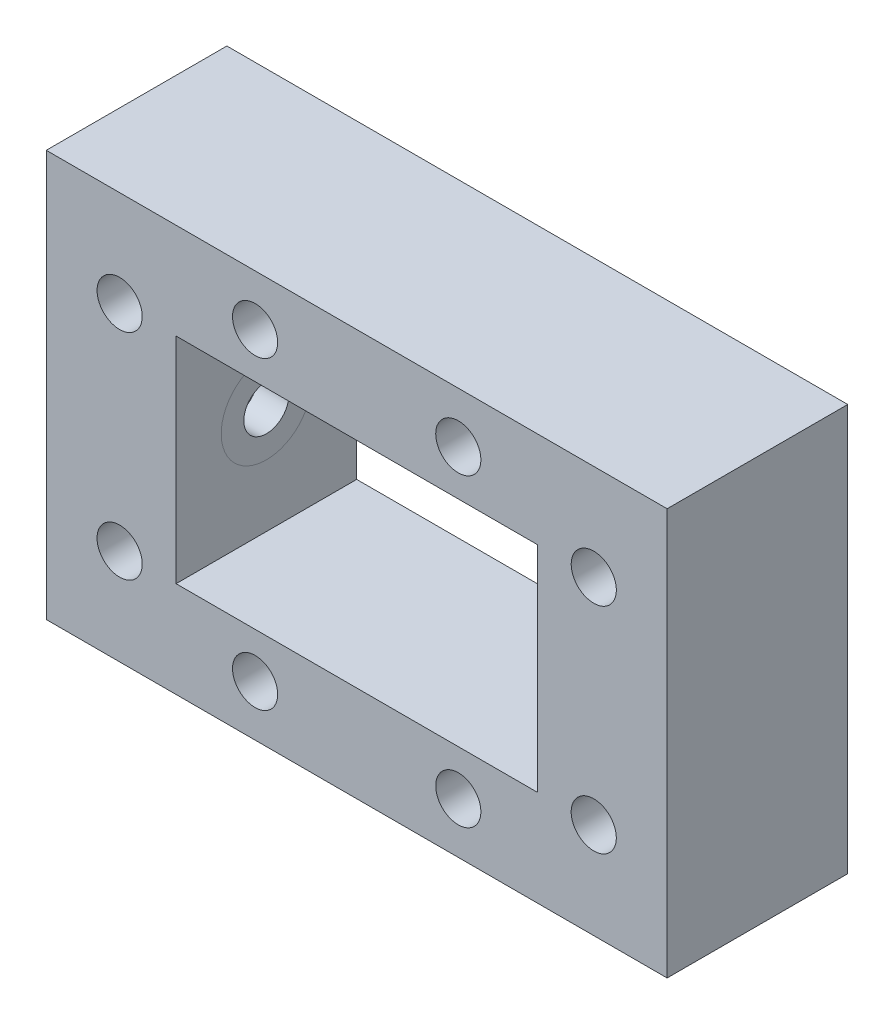
ISO-10303-21;
HEADER;
FILE_DESCRIPTION(('STEP AP214'),'2;1');
FILE_NAME('part.step','',(''),(''),'','','');
FILE_SCHEMA(('AUTOMOTIVE_DESIGN { 1 0 10303 214 1 1 1 1 }'));
ENDSEC;
DATA;
#1=APPLICATION_CONTEXT('core data for automotive mechanical design processes');
#2=APPLICATION_PROTOCOL_DEFINITION('international standard','automotive_design',2000,#1);
#3=PRODUCT_CONTEXT('',#1,'mechanical');
#4=PRODUCT('Part','Part','',(#3));
#5=PRODUCT_RELATED_PRODUCT_CATEGORY('part','',(#4));
#6=PRODUCT_DEFINITION_FORMATION('','',#4);
#7=PRODUCT_DEFINITION_CONTEXT('part definition',#1,'design');
#8=PRODUCT_DEFINITION('design','',#6,#7);
#9=PRODUCT_DEFINITION_SHAPE('','',#8);
#10=(LENGTH_UNIT() NAMED_UNIT(*) SI_UNIT(.MILLI.,.METRE.));
#11=(NAMED_UNIT(*) PLANE_ANGLE_UNIT() SI_UNIT($,.RADIAN.));
#12=(NAMED_UNIT(*) SI_UNIT($,.STERADIAN.) SOLID_ANGLE_UNIT());
#13=UNCERTAINTY_MEASURE_WITH_UNIT(LENGTH_MEASURE(1.E-05),#10,'distance_accuracy_value','');
#14=(GEOMETRIC_REPRESENTATION_CONTEXT(3) GLOBAL_UNCERTAINTY_ASSIGNED_CONTEXT((#13)) GLOBAL_UNIT_ASSIGNED_CONTEXT((#10,
#11,#12)) REPRESENTATION_CONTEXT('',''));
#15=CARTESIAN_POINT('',(0.,0.,0.));
#16=DIRECTION('',(0.,0.,1.));
#17=DIRECTION('',(1.,0.,0.));
#18=AXIS2_PLACEMENT_3D('',#15,#16,#17);
#19=CARTESIAN_POINT('',(-20.5,0.,0.));
#20=DIRECTION('',(1.,0.,0.));
#21=DIRECTION('',(0.,1.,0.));
#22=AXIS2_PLACEMENT_3D('',#19,#20,#21);
#23=CYLINDRICAL_SURFACE('',#22,4.);
#24=CARTESIAN_POINT('',(-19.9226497308104,0.,0.));
#25=DIRECTION('',(-1.,0.,0.));
#26=DIRECTION('',(0.,0.,1.));
#27=AXIS2_PLACEMENT_3D('',#24,#25,#26);
#28=CIRCLE('',#27,4.);
#29=CARTESIAN_POINT('',(-19.9226497308104,0.,4.));
#30=VERTEX_POINT('',#29);
#31=EDGE_CURVE('E55',#30,#30,#28,.T.);
#32=ORIENTED_EDGE('',*,*,#31,.F.);
#33=EDGE_LOOP('',(#32));
#34=FACE_BOUND('',#33,.T.);
#35=CARTESIAN_POINT('',(-16.,0.,0.));
#36=DIRECTION('',(1.,0.,0.));
#37=DIRECTION('',(0.,1.,0.));
#38=AXIS2_PLACEMENT_3D('',#35,#36,#37);
#39=CIRCLE('',#38,4.);
#40=CARTESIAN_POINT('',(-16.,4.,0.));
#41=VERTEX_POINT('',#40);
#42=EDGE_CURVE('E11',#41,#41,#39,.T.);
#43=ORIENTED_EDGE('',*,*,#42,.F.);
#44=EDGE_LOOP('',(#43));
#45=FACE_BOUND('',#44,.T.);
#46=ADVANCED_FACE('F44',(#34,#45),#23,.T.);
#47=CARTESIAN_POINT('',(-16.,0.,0.));
#48=DIRECTION('',(1.,0.,0.));
#49=DIRECTION('',(0.,1.,0.));
#50=AXIS2_PLACEMENT_3D('',#47,#48,#49);
#51=PLANE('',#50);
#52=CARTESIAN_POINT('',(-16.,0.,0.));
#53=DIRECTION('',(1.,0.,0.));
#54=DIRECTION('',(0.,1.,0.));
#55=AXIS2_PLACEMENT_3D('',#52,#53,#54);
#56=CIRCLE('',#55,2.);
#57=CARTESIAN_POINT('',(-16.,2.,0.));
#58=VERTEX_POINT('',#57);
#59=EDGE_CURVE('E51',#58,#58,#56,.T.);
#60=ORIENTED_EDGE('',*,*,#59,.F.);
#61=EDGE_LOOP('',(#60));
#62=FACE_BOUND('',#61,.T.);
#63=ORIENTED_EDGE('',*,*,#42,.T.);
#64=EDGE_LOOP('',(#63));
#65=FACE_BOUND('',#64,.T.);
#66=ADVANCED_FACE('F73',(#62,#65),#51,.T.);
#67=CARTESIAN_POINT('',(-20.5,0.,0.));
#68=DIRECTION('',(1.,0.,0.));
#69=DIRECTION('',(0.,1.,0.));
#70=AXIS2_PLACEMENT_3D('',#67,#68,#69);
#71=CYLINDRICAL_SURFACE('',#70,2.);
#72=CARTESIAN_POINT('',(-18.7679491924311,0.,0.));
#73=DIRECTION('',(-1.,0.,0.));
#74=DIRECTION('',(0.,0.,1.));
#75=AXIS2_PLACEMENT_3D('',#72,#73,#74);
#76=CIRCLE('',#75,2.);
#77=CARTESIAN_POINT('',(-18.7679491924311,0.,2.));
#78=VERTEX_POINT('',#77);
#79=EDGE_CURVE('E47',#78,#78,#76,.T.);
#80=ORIENTED_EDGE('',*,*,#79,.T.);
#81=EDGE_LOOP('',(#80));
#82=FACE_BOUND('',#81,.T.);
#83=ORIENTED_EDGE('',*,*,#59,.T.);
#84=EDGE_LOOP('',(#83));
#85=FACE_BOUND('',#84,.T.);
#86=ADVANCED_FACE('F64',(#82,#85),#71,.F.);
#87=CARTESIAN_POINT('',(-17.6132486540518,0.,0.));
#88=DIRECTION('',(-1.,0.,0.));
#89=DIRECTION('',(0.,0.,1.));
#90=AXIS2_PLACEMENT_3D('',#87,#88,#89);
#91=CONICAL_SURFACE('',#90,0.,1.04719755119659);
#92=ORIENTED_EDGE('',*,*,#31,.T.);
#93=EDGE_LOOP('',(#92));
#94=FACE_BOUND('',#93,.T.);
#95=ORIENTED_EDGE('',*,*,#79,.F.);
#96=EDGE_LOOP('',(#95));
#97=FACE_BOUND('',#96,.T.);
#98=ADVANCED_FACE('F67',(#94,#97),#91,.F.);
#99=CLOSED_SHELL('',(#46,#66,#86,#98));
#100=MANIFOLD_SOLID_BREP('B2',#99);
#101=CARTESIAN_POINT('',(0.,0.,8.));
#102=DIRECTION('',(0.,0.,1.));
#103=DIRECTION('',(1.,0.,0.));
#104=AXIS2_PLACEMENT_3D('',#101,#102,#103);
#105=PLANE('',#104);
#106=CARTESIAN_POINT('',(8.99999999999999,13.5,8.));
#107=DIRECTION('',(0.,0.,1.));
#108=DIRECTION('',(-1.,0.,0.));
#109=AXIS2_PLACEMENT_3D('',#106,#107,#108);
#110=CIRCLE('',#109,2.);
#111=CARTESIAN_POINT('',(6.99999999999999,13.5,8.));
#112=VERTEX_POINT('',#111);
#113=EDGE_CURVE('E304',#112,#112,#110,.T.);
#114=ORIENTED_EDGE('',*,*,#113,.F.);
#115=EDGE_LOOP('',(#114));
#116=FACE_BOUND('',#115,.T.);
#117=CARTESIAN_POINT('',(8.99999999999999,-13.5,8.));
#118=DIRECTION('',(0.,0.,1.));
#119=DIRECTION('',(1.,0.,0.));
#120=AXIS2_PLACEMENT_3D('',#117,#118,#119);
#121=CIRCLE('',#120,2.);
#122=CARTESIAN_POINT('',(11.,-13.5,8.));
#123=VERTEX_POINT('',#122);
#124=EDGE_CURVE('E316',#123,#123,#121,.T.);
#125=ORIENTED_EDGE('',*,*,#124,.F.);
#126=EDGE_LOOP('',(#125));
#127=FACE_BOUND('',#126,.T.);
#128=CARTESIAN_POINT('',(-21.,-9.50000000000001,8.));
#129=DIRECTION('',(0.,0.,1.));
#130=DIRECTION('',(-1.,0.,0.));
#131=AXIS2_PLACEMENT_3D('',#128,#129,#130);
#132=CIRCLE('',#131,2.);
#133=CARTESIAN_POINT('',(-23.,-9.50000000000001,8.));
#134=VERTEX_POINT('',#133);
#135=EDGE_CURVE('E328',#134,#134,#132,.T.);
#136=ORIENTED_EDGE('',*,*,#135,.F.);
#137=EDGE_LOOP('',(#136));
#138=FACE_BOUND('',#137,.T.);
#139=CARTESIAN_POINT('',(-21.,9.50000000000001,8.));
#140=DIRECTION('',(0.,0.,1.));
#141=DIRECTION('',(1.,0.,0.));
#142=AXIS2_PLACEMENT_3D('',#139,#140,#141);
#143=CIRCLE('',#142,2.);
#144=CARTESIAN_POINT('',(-19.,9.50000000000001,8.));
#145=VERTEX_POINT('',#144);
#146=EDGE_CURVE('E200',#145,#145,#143,.T.);
#147=ORIENTED_EDGE('',*,*,#146,.F.);
#148=EDGE_LOOP('',(#147));
#149=FACE_BOUND('',#148,.T.);
#150=DIRECTION('',(0.,1.,0.));
#151=VECTOR('',#150,1.);
#152=CARTESIAN_POINT('',(27.5,18.,8.));
#153=LINE('',#152,#151);
#154=CARTESIAN_POINT('',(27.5,-18.,8.));
#155=VERTEX_POINT('',#154);
#156=CARTESIAN_POINT('',(27.5,18.,8.));
#157=VERTEX_POINT('',#156);
#158=EDGE_CURVE('E210',#155,#157,#153,.T.);
#159=ORIENTED_EDGE('',*,*,#158,.T.);
#160=DIRECTION('',(-1.,0.,0.));
#161=VECTOR('',#160,1.);
#162=CARTESIAN_POINT('',(-27.5,18.,8.));
#163=LINE('',#162,#161);
#164=CARTESIAN_POINT('',(-27.5,18.,8.));
#165=VERTEX_POINT('',#164);
#166=EDGE_CURVE('E213',#157,#165,#163,.T.);
#167=ORIENTED_EDGE('',*,*,#166,.T.);
#168=DIRECTION('',(0.,-1.,0.));
#169=VECTOR('',#168,1.);
#170=CARTESIAN_POINT('',(-27.5,18.,8.));
#171=LINE('',#170,#169);
#172=CARTESIAN_POINT('',(-27.5,-18.,8.));
#173=VERTEX_POINT('',#172);
#174=EDGE_CURVE('E216',#165,#173,#171,.T.);
#175=ORIENTED_EDGE('',*,*,#174,.T.);
#176=DIRECTION('',(1.,0.,0.));
#177=VECTOR('',#176,1.);
#178=CARTESIAN_POINT('',(-27.5,-18.,8.));
#179=LINE('',#178,#177);
#180=EDGE_CURVE('E218',#173,#155,#179,.T.);
#181=ORIENTED_EDGE('',*,*,#180,.T.);
#182=EDGE_LOOP('',(#159,#167,#175,#181));
#183=FACE_BOUND('',#182,.T.);
#184=DIRECTION('',(-1.,0.,0.));
#185=VECTOR('',#184,1.);
#186=CARTESIAN_POINT('',(-16.,9.5,8.));
#187=LINE('',#186,#185);
#188=CARTESIAN_POINT('',(16.,9.5,8.));
#189=VERTEX_POINT('',#188);
#190=CARTESIAN_POINT('',(-16.,9.5,8.));
#191=VERTEX_POINT('',#190);
#192=EDGE_CURVE('E179',#189,#191,#187,.T.);
#193=ORIENTED_EDGE('',*,*,#192,.F.);
#194=DIRECTION('',(0.,1.,0.));
#195=VECTOR('',#194,1.);
#196=CARTESIAN_POINT('',(16.,9.5,8.));
#197=LINE('',#196,#195);
#198=CARTESIAN_POINT('',(16.,-9.5,8.));
#199=VERTEX_POINT('',#198);
#200=EDGE_CURVE('E171',#199,#189,#197,.T.);
#201=ORIENTED_EDGE('',*,*,#200,.F.);
#202=DIRECTION('',(1.,0.,0.));
#203=VECTOR('',#202,1.);
#204=CARTESIAN_POINT('',(-16.,-9.5,8.));
#205=LINE('',#204,#203);
#206=CARTESIAN_POINT('',(-16.,-9.5,8.));
#207=VERTEX_POINT('',#206);
#208=EDGE_CURVE('E194',#207,#199,#205,.T.);
#209=ORIENTED_EDGE('',*,*,#208,.F.);
#210=DIRECTION('',(0.,-1.,0.));
#211=VECTOR('',#210,1.);
#212=CARTESIAN_POINT('',(-16.,9.5,8.));
#213=LINE('',#212,#211);
#214=EDGE_CURVE('E192',#191,#207,#213,.T.);
#215=ORIENTED_EDGE('',*,*,#214,.F.);
#216=EDGE_LOOP('',(#193,#201,#209,#215));
#217=FACE_BOUND('',#216,.T.);
#218=CARTESIAN_POINT('',(-9.,13.5,8.));
#219=DIRECTION('',(0.,0.,1.));
#220=DIRECTION('',(1.,0.,0.));
#221=AXIS2_PLACEMENT_3D('',#218,#219,#220);
#222=CIRCLE('',#221,2.);
#223=CARTESIAN_POINT('',(-7.,13.5,8.));
#224=VERTEX_POINT('',#223);
#225=EDGE_CURVE('E334',#224,#224,#222,.T.);
#226=ORIENTED_EDGE('',*,*,#225,.F.);
#227=EDGE_LOOP('',(#226));
#228=FACE_BOUND('',#227,.T.);
#229=CARTESIAN_POINT('',(-9.,-13.5,8.));
#230=DIRECTION('',(0.,0.,1.));
#231=DIRECTION('',(-1.,0.,0.));
#232=AXIS2_PLACEMENT_3D('',#229,#230,#231);
#233=CIRCLE('',#232,2.);
#234=CARTESIAN_POINT('',(-11.,-13.5,8.));
#235=VERTEX_POINT('',#234);
#236=EDGE_CURVE('E322',#235,#235,#233,.T.);
#237=ORIENTED_EDGE('',*,*,#236,.F.);
#238=EDGE_LOOP('',(#237));
#239=FACE_BOUND('',#238,.T.);
#240=CARTESIAN_POINT('',(21.,-9.50000000000001,8.));
#241=DIRECTION('',(0.,0.,1.));
#242=DIRECTION('',(1.,0.,0.));
#243=AXIS2_PLACEMENT_3D('',#240,#241,#242);
#244=CIRCLE('',#243,2.);
#245=CARTESIAN_POINT('',(23.,-9.50000000000001,8.));
#246=VERTEX_POINT('',#245);
#247=EDGE_CURVE('E310',#246,#246,#244,.T.);
#248=ORIENTED_EDGE('',*,*,#247,.F.);
#249=EDGE_LOOP('',(#248));
#250=FACE_BOUND('',#249,.T.);
#251=CARTESIAN_POINT('',(21.,9.50000000000001,8.));
#252=DIRECTION('',(0.,0.,1.));
#253=DIRECTION('',(-1.,0.,0.));
#254=AXIS2_PLACEMENT_3D('',#251,#252,#253);
#255=CIRCLE('',#254,2.);
#256=CARTESIAN_POINT('',(19.,9.50000000000001,8.));
#257=VERTEX_POINT('',#256);
#258=EDGE_CURVE('E296',#257,#257,#255,.T.);
#259=ORIENTED_EDGE('',*,*,#258,.F.);
#260=EDGE_LOOP('',(#259));
#261=FACE_BOUND('',#260,.T.);
#262=ADVANCED_FACE('F105',(#116,#127,#138,#149,#183,#217,#228,#239,#250,#261),#105,.T.);
#263=CARTESIAN_POINT('',(0.,0.,-8.));
#264=DIRECTION('',(0.,0.,1.));
#265=DIRECTION('',(1.,0.,0.));
#266=AXIS2_PLACEMENT_3D('',#263,#264,#265);
#267=PLANE('',#266);
#268=DIRECTION('',(0.,1.,0.));
#269=VECTOR('',#268,1.);
#270=CARTESIAN_POINT('',(27.5,18.,-8.));
#271=LINE('',#270,#269);
#272=CARTESIAN_POINT('',(27.5,-18.,-8.));
#273=VERTEX_POINT('',#272);
#274=CARTESIAN_POINT('',(27.5,18.,-8.));
#275=VERTEX_POINT('',#274);
#276=EDGE_CURVE('E187',#273,#275,#271,.T.);
#277=ORIENTED_EDGE('',*,*,#276,.F.);
#278=DIRECTION('',(1.,0.,0.));
#279=VECTOR('',#278,1.);
#280=CARTESIAN_POINT('',(-27.5,-18.,-8.));
#281=LINE('',#280,#279);
#282=CARTESIAN_POINT('',(-27.5,-18.,-8.));
#283=VERTEX_POINT('',#282);
#284=EDGE_CURVE('E214',#283,#273,#281,.T.);
#285=ORIENTED_EDGE('',*,*,#284,.F.);
#286=DIRECTION('',(0.,-1.,0.));
#287=VECTOR('',#286,1.);
#288=CARTESIAN_POINT('',(-27.5,18.,-8.));
#289=LINE('',#288,#287);
#290=CARTESIAN_POINT('',(-27.5,18.,-8.));
#291=VERTEX_POINT('',#290);
#292=EDGE_CURVE('E225',#291,#283,#289,.T.);
#293=ORIENTED_EDGE('',*,*,#292,.F.);
#294=DIRECTION('',(-1.,0.,0.));
#295=VECTOR('',#294,1.);
#296=CARTESIAN_POINT('',(-27.5,18.,-8.));
#297=LINE('',#296,#295);
#298=EDGE_CURVE('E223',#275,#291,#297,.T.);
#299=ORIENTED_EDGE('',*,*,#298,.F.);
#300=EDGE_LOOP('',(#277,#285,#293,#299));
#301=FACE_BOUND('',#300,.T.);
#302=DIRECTION('',(0.,1.,0.));
#303=VECTOR('',#302,1.);
#304=CARTESIAN_POINT('',(16.,9.5,-8.));
#305=LINE('',#304,#303);
#306=CARTESIAN_POINT('',(16.,-9.5,-8.));
#307=VERTEX_POINT('',#306);
#308=CARTESIAN_POINT('',(16.,9.5,-8.));
#309=VERTEX_POINT('',#308);
#310=EDGE_CURVE('E129',#307,#309,#305,.T.);
#311=ORIENTED_EDGE('',*,*,#310,.T.);
#312=DIRECTION('',(-1.,0.,0.));
#313=VECTOR('',#312,1.);
#314=CARTESIAN_POINT('',(-16.,9.5,-8.));
#315=LINE('',#314,#313);
#316=CARTESIAN_POINT('',(-16.,9.5,-8.));
#317=VERTEX_POINT('',#316);
#318=EDGE_CURVE('E186',#309,#317,#315,.T.);
#319=ORIENTED_EDGE('',*,*,#318,.T.);
#320=DIRECTION('',(0.,-1.,0.));
#321=VECTOR('',#320,1.);
#322=CARTESIAN_POINT('',(-16.,9.5,-8.));
#323=LINE('',#322,#321);
#324=CARTESIAN_POINT('',(-16.,-9.5,-8.));
#325=VERTEX_POINT('',#324);
#326=EDGE_CURVE('E202',#317,#325,#323,.T.);
#327=ORIENTED_EDGE('',*,*,#326,.T.);
#328=DIRECTION('',(1.,0.,0.));
#329=VECTOR('',#328,1.);
#330=CARTESIAN_POINT('',(-16.,-9.5,-8.));
#331=LINE('',#330,#329);
#332=EDGE_CURVE('E180',#325,#307,#331,.T.);
#333=ORIENTED_EDGE('',*,*,#332,.T.);
#334=EDGE_LOOP('',(#311,#319,#327,#333));
#335=FACE_BOUND('',#334,.T.);
#336=CARTESIAN_POINT('',(-21.,9.50000000000001,-8.));
#337=DIRECTION('',(0.,0.,1.));
#338=DIRECTION('',(1.,0.,0.));
#339=AXIS2_PLACEMENT_3D('',#336,#337,#338);
#340=CIRCLE('',#339,2.);
#341=CARTESIAN_POINT('',(-19.,9.50000000000001,-8.));
#342=VERTEX_POINT('',#341);
#343=EDGE_CURVE('E337',#342,#342,#340,.T.);
#344=ORIENTED_EDGE('',*,*,#343,.T.);
#345=EDGE_LOOP('',(#344));
#346=FACE_BOUND('',#345,.T.);
#347=CARTESIAN_POINT('',(-9.,13.5,-8.));
#348=DIRECTION('',(0.,0.,1.));
#349=DIRECTION('',(1.,0.,0.));
#350=AXIS2_PLACEMENT_3D('',#347,#348,#349);
#351=CIRCLE('',#350,2.);
#352=CARTESIAN_POINT('',(-7.,13.5,-8.));
#353=VERTEX_POINT('',#352);
#354=EDGE_CURVE('E331',#353,#353,#351,.T.);
#355=ORIENTED_EDGE('',*,*,#354,.T.);
#356=EDGE_LOOP('',(#355));
#357=FACE_BOUND('',#356,.T.);
#358=CARTESIAN_POINT('',(-21.,-9.50000000000001,-8.));
#359=DIRECTION('',(0.,0.,1.));
#360=DIRECTION('',(-1.,0.,0.));
#361=AXIS2_PLACEMENT_3D('',#358,#359,#360);
#362=CIRCLE('',#361,2.);
#363=CARTESIAN_POINT('',(-23.,-9.50000000000001,-8.));
#364=VERTEX_POINT('',#363);
#365=EDGE_CURVE('E325',#364,#364,#362,.T.);
#366=ORIENTED_EDGE('',*,*,#365,.T.);
#367=EDGE_LOOP('',(#366));
#368=FACE_BOUND('',#367,.T.);
#369=CARTESIAN_POINT('',(-9.,-13.5,-8.));
#370=DIRECTION('',(0.,0.,1.));
#371=DIRECTION('',(-1.,0.,0.));
#372=AXIS2_PLACEMENT_3D('',#369,#370,#371);
#373=CIRCLE('',#372,2.);
#374=CARTESIAN_POINT('',(-11.,-13.5,-8.));
#375=VERTEX_POINT('',#374);
#376=EDGE_CURVE('E319',#375,#375,#373,.T.);
#377=ORIENTED_EDGE('',*,*,#376,.T.);
#378=EDGE_LOOP('',(#377));
#379=FACE_BOUND('',#378,.T.);
#380=CARTESIAN_POINT('',(8.99999999999999,-13.5,-8.));
#381=DIRECTION('',(0.,0.,1.));
#382=DIRECTION('',(1.,0.,0.));
#383=AXIS2_PLACEMENT_3D('',#380,#381,#382);
#384=CIRCLE('',#383,2.);
#385=CARTESIAN_POINT('',(11.,-13.5,-8.));
#386=VERTEX_POINT('',#385);
#387=EDGE_CURVE('E313',#386,#386,#384,.T.);
#388=ORIENTED_EDGE('',*,*,#387,.T.);
#389=EDGE_LOOP('',(#388));
#390=FACE_BOUND('',#389,.T.);
#391=CARTESIAN_POINT('',(21.,-9.50000000000001,-8.));
#392=DIRECTION('',(0.,0.,1.));
#393=DIRECTION('',(1.,0.,0.));
#394=AXIS2_PLACEMENT_3D('',#391,#392,#393);
#395=CIRCLE('',#394,2.);
#396=CARTESIAN_POINT('',(23.,-9.50000000000001,-8.));
#397=VERTEX_POINT('',#396);
#398=EDGE_CURVE('E307',#397,#397,#395,.T.);
#399=ORIENTED_EDGE('',*,*,#398,.T.);
#400=EDGE_LOOP('',(#399));
#401=FACE_BOUND('',#400,.T.);
#402=CARTESIAN_POINT('',(8.99999999999999,13.5,-8.));
#403=DIRECTION('',(0.,0.,1.));
#404=DIRECTION('',(-1.,0.,0.));
#405=AXIS2_PLACEMENT_3D('',#402,#403,#404);
#406=CIRCLE('',#405,2.);
#407=CARTESIAN_POINT('',(6.99999999999999,13.5,-8.));
#408=VERTEX_POINT('',#407);
#409=EDGE_CURVE('E299',#408,#408,#406,.T.);
#410=ORIENTED_EDGE('',*,*,#409,.T.);
#411=EDGE_LOOP('',(#410));
#412=FACE_BOUND('',#411,.T.);
#413=CARTESIAN_POINT('',(21.,9.50000000000001,-8.));
#414=DIRECTION('',(0.,0.,1.));
#415=DIRECTION('',(-1.,0.,0.));
#416=AXIS2_PLACEMENT_3D('',#413,#414,#415);
#417=CIRCLE('',#416,2.);
#418=CARTESIAN_POINT('',(19.,9.50000000000001,-8.));
#419=VERTEX_POINT('',#418);
#420=EDGE_CURVE('E300',#419,#419,#417,.T.);
#421=ORIENTED_EDGE('',*,*,#420,.T.);
#422=EDGE_LOOP('',(#421));
#423=FACE_BOUND('',#422,.T.);
#424=ADVANCED_FACE('F244',(#301,#335,#346,#357,#368,#379,#390,#401,#412,#423),#267,.F.);
#425=CARTESIAN_POINT('',(27.5,18.,8.));
#426=DIRECTION('',(-1.,0.,0.));
#427=DIRECTION('',(0.,-1.,0.));
#428=AXIS2_PLACEMENT_3D('',#425,#426,#427);
#429=PLANE('',#428);
#430=ORIENTED_EDGE('',*,*,#276,.T.);
#431=DIRECTION('',(0.,0.,-1.));
#432=VECTOR('',#431,1.);
#433=CARTESIAN_POINT('',(27.5,18.,8.));
#434=LINE('',#433,#432);
#435=EDGE_CURVE('E42',#157,#275,#434,.T.);
#436=ORIENTED_EDGE('',*,*,#435,.F.);
#437=ORIENTED_EDGE('',*,*,#158,.F.);
#438=DIRECTION('',(0.,0.,-1.));
#439=VECTOR('',#438,1.);
#440=CARTESIAN_POINT('',(27.5,-18.,8.));
#441=LINE('',#440,#439);
#442=EDGE_CURVE('E220',#155,#273,#441,.T.);
#443=ORIENTED_EDGE('',*,*,#442,.T.);
#444=EDGE_LOOP('',(#430,#436,#437,#443));
#445=FACE_BOUND('',#444,.T.);
#446=ADVANCED_FACE('F107',(#445),#429,.F.);
#447=CARTESIAN_POINT('',(-27.5,18.,8.));
#448=DIRECTION('',(0.,-1.,0.));
#449=DIRECTION('',(0.,0.,-1.));
#450=AXIS2_PLACEMENT_3D('',#447,#448,#449);
#451=PLANE('',#450);
#452=ORIENTED_EDGE('',*,*,#298,.T.);
#453=DIRECTION('',(0.,0.,-1.));
#454=VECTOR('',#453,1.);
#455=CARTESIAN_POINT('',(-27.5,18.,8.));
#456=LINE('',#455,#454);
#457=EDGE_CURVE('E114',#165,#291,#456,.T.);
#458=ORIENTED_EDGE('',*,*,#457,.F.);
#459=ORIENTED_EDGE('',*,*,#166,.F.);
#460=ORIENTED_EDGE('',*,*,#435,.T.);
#461=EDGE_LOOP('',(#452,#458,#459,#460));
#462=FACE_BOUND('',#461,.T.);
#463=ADVANCED_FACE('F254',(#462),#451,.F.);
#464=CARTESIAN_POINT('',(-27.5,18.,8.));
#465=DIRECTION('',(1.,0.,0.));
#466=DIRECTION('',(0.,0.,-1.));
#467=AXIS2_PLACEMENT_3D('',#464,#465,#466);
#468=PLANE('',#467);
#469=CARTESIAN_POINT('',(-27.5,0.,0.));
#470=DIRECTION('',(1.,0.,0.));
#471=DIRECTION('',(0.,0.,-1.));
#472=AXIS2_PLACEMENT_3D('',#469,#470,#471);
#473=CIRCLE('',#472,5.);
#474=CARTESIAN_POINT('',(-27.5,0.,-5.));
#475=VERTEX_POINT('',#474);
#476=EDGE_CURVE('E585',#475,#475,#473,.T.);
#477=ORIENTED_EDGE('',*,*,#476,.T.);
#478=EDGE_LOOP('',(#477));
#479=FACE_BOUND('',#478,.T.);
#480=ORIENTED_EDGE('',*,*,#292,.T.);
#481=DIRECTION('',(0.,0.,-1.));
#482=VECTOR('',#481,1.);
#483=CARTESIAN_POINT('',(-27.5,-18.,8.));
#484=LINE('',#483,#482);
#485=EDGE_CURVE('E230',#173,#283,#484,.T.);
#486=ORIENTED_EDGE('',*,*,#485,.F.);
#487=ORIENTED_EDGE('',*,*,#174,.F.);
#488=ORIENTED_EDGE('',*,*,#457,.T.);
#489=EDGE_LOOP('',(#480,#486,#487,#488));
#490=FACE_BOUND('',#489,.T.);
#491=ADVANCED_FACE('F238',(#479,#490),#468,.F.);
#492=CARTESIAN_POINT('',(-27.5,-18.,8.));
#493=DIRECTION('',(0.,1.,0.));
#494=DIRECTION('',(0.,0.,1.));
#495=AXIS2_PLACEMENT_3D('',#492,#493,#494);
#496=PLANE('',#495);
#497=CARTESIAN_POINT('',(-15.,-18.,0.));
#498=DIRECTION('',(0.,-1.,0.));
#499=DIRECTION('',(0.,0.,-1.));
#500=AXIS2_PLACEMENT_3D('',#497,#498,#499);
#501=CIRCLE('',#500,2.);
#502=CARTESIAN_POINT('',(-15.,-18.,-2.));
#503=VERTEX_POINT('',#502);
#504=EDGE_CURVE('E282',#503,#503,#501,.T.);
#505=ORIENTED_EDGE('',*,*,#504,.F.);
#506=EDGE_LOOP('',(#505));
#507=FACE_BOUND('',#506,.T.);
#508=CARTESIAN_POINT('',(15.,-18.,0.));
#509=DIRECTION('',(0.,-1.,0.));
#510=DIRECTION('',(0.,0.,1.));
#511=AXIS2_PLACEMENT_3D('',#508,#509,#510);
#512=CIRCLE('',#511,2.);
#513=CARTESIAN_POINT('',(15.,-18.,2.));
#514=VERTEX_POINT('',#513);
#515=EDGE_CURVE('E285',#514,#514,#512,.T.);
#516=ORIENTED_EDGE('',*,*,#515,.F.);
#517=EDGE_LOOP('',(#516));
#518=FACE_BOUND('',#517,.T.);
#519=ORIENTED_EDGE('',*,*,#284,.T.);
#520=ORIENTED_EDGE('',*,*,#442,.F.);
#521=ORIENTED_EDGE('',*,*,#180,.F.);
#522=ORIENTED_EDGE('',*,*,#485,.T.);
#523=EDGE_LOOP('',(#519,#520,#521,#522));
#524=FACE_BOUND('',#523,.T.);
#525=ADVANCED_FACE('F248',(#507,#518,#524),#496,.F.);
#526=CARTESIAN_POINT('',(16.,9.5,8.));
#527=DIRECTION('',(-1.,0.,0.));
#528=DIRECTION('',(0.,-1.,0.));
#529=AXIS2_PLACEMENT_3D('',#526,#527,#528);
#530=PLANE('',#529);
#531=ORIENTED_EDGE('',*,*,#310,.F.);
#532=DIRECTION('',(0.,0.,-1.));
#533=VECTOR('',#532,1.);
#534=CARTESIAN_POINT('',(16.,-9.5,8.));
#535=LINE('',#534,#533);
#536=EDGE_CURVE('E175',#199,#307,#535,.T.);
#537=ORIENTED_EDGE('',*,*,#536,.F.);
#538=ORIENTED_EDGE('',*,*,#200,.T.);
#539=DIRECTION('',(0.,0.,-1.));
#540=VECTOR('',#539,1.);
#541=CARTESIAN_POINT('',(16.,9.5,8.));
#542=LINE('',#541,#540);
#543=EDGE_CURVE('E174',#189,#309,#542,.T.);
#544=ORIENTED_EDGE('',*,*,#543,.T.);
#545=EDGE_LOOP('',(#531,#537,#538,#544));
#546=FACE_BOUND('',#545,.T.);
#547=ADVANCED_FACE('F173',(#546),#530,.T.);
#548=CARTESIAN_POINT('',(-16.,9.5,8.));
#549=DIRECTION('',(0.,-1.,0.));
#550=DIRECTION('',(0.,0.,-1.));
#551=AXIS2_PLACEMENT_3D('',#548,#549,#550);
#552=PLANE('',#551);
#553=ORIENTED_EDGE('',*,*,#318,.F.);
#554=ORIENTED_EDGE('',*,*,#543,.F.);
#555=ORIENTED_EDGE('',*,*,#192,.T.);
#556=DIRECTION('',(0.,0.,-1.));
#557=VECTOR('',#556,1.);
#558=CARTESIAN_POINT('',(-16.,9.5,8.));
#559=LINE('',#558,#557);
#560=EDGE_CURVE('E188',#191,#317,#559,.T.);
#561=ORIENTED_EDGE('',*,*,#560,.T.);
#562=EDGE_LOOP('',(#553,#554,#555,#561));
#563=FACE_BOUND('',#562,.T.);
#564=ADVANCED_FACE('F183',(#563),#552,.T.);
#565=CARTESIAN_POINT('',(-16.,9.5,8.));
#566=DIRECTION('',(1.,0.,0.));
#567=DIRECTION('',(0.,1.,0.));
#568=AXIS2_PLACEMENT_3D('',#565,#566,#567);
#569=PLANE('',#568);
#570=CARTESIAN_POINT('',(-16.,0.,0.));
#571=DIRECTION('',(1.,0.,0.));
#572=DIRECTION('',(0.,1.,0.));
#573=AXIS2_PLACEMENT_3D('',#570,#571,#572);
#574=CIRCLE('',#573,4.);
#575=CARTESIAN_POINT('',(-16.,4.,0.));
#576=VERTEX_POINT('',#575);
#577=EDGE_CURVE('E288',#576,#576,#574,.T.);
#578=ORIENTED_EDGE('',*,*,#577,.F.);
#579=EDGE_LOOP('',(#578));
#580=FACE_BOUND('',#579,.T.);
#581=ORIENTED_EDGE('',*,*,#326,.F.);
#582=ORIENTED_EDGE('',*,*,#560,.F.);
#583=ORIENTED_EDGE('',*,*,#214,.T.);
#584=DIRECTION('',(0.,0.,-1.));
#585=VECTOR('',#584,1.);
#586=CARTESIAN_POINT('',(-16.,-9.5,8.));
#587=LINE('',#586,#585);
#588=EDGE_CURVE('E121',#207,#325,#587,.T.);
#589=ORIENTED_EDGE('',*,*,#588,.T.);
#590=EDGE_LOOP('',(#581,#582,#583,#589));
#591=FACE_BOUND('',#590,.T.);
#592=ADVANCED_FACE('F359',(#580,#591),#569,.T.);
#593=CARTESIAN_POINT('',(-16.,-9.5,8.));
#594=DIRECTION('',(0.,1.,0.));
#595=DIRECTION('',(0.,0.,1.));
#596=AXIS2_PLACEMENT_3D('',#593,#594,#595);
#597=PLANE('',#596);
#598=ORIENTED_EDGE('',*,*,#332,.F.);
#599=ORIENTED_EDGE('',*,*,#588,.F.);
#600=ORIENTED_EDGE('',*,*,#208,.T.);
#601=ORIENTED_EDGE('',*,*,#536,.T.);
#602=EDGE_LOOP('',(#598,#599,#600,#601));
#603=FACE_BOUND('',#602,.T.);
#604=ADVANCED_FACE('F349',(#603),#597,.T.);
#605=CARTESIAN_POINT('',(-21.,9.50000000000001,8.));
#606=DIRECTION('',(0.,0.,-1.));
#607=DIRECTION('',(-1.,0.,0.));
#608=AXIS2_PLACEMENT_3D('',#605,#606,#607);
#609=CYLINDRICAL_SURFACE('',#608,2.);
#610=ORIENTED_EDGE('',*,*,#146,.T.);
#611=EDGE_LOOP('',(#610));
#612=FACE_BOUND('',#611,.T.);
#613=ORIENTED_EDGE('',*,*,#343,.F.);
#614=EDGE_LOOP('',(#613));
#615=FACE_BOUND('',#614,.T.);
#616=ADVANCED_FACE('F346',(#612,#615),#609,.F.);
#617=CARTESIAN_POINT('',(-9.,13.5,8.));
#618=DIRECTION('',(0.,0.,-1.));
#619=DIRECTION('',(-1.,0.,0.));
#620=AXIS2_PLACEMENT_3D('',#617,#618,#619);
#621=CYLINDRICAL_SURFACE('',#620,2.);
#622=ORIENTED_EDGE('',*,*,#225,.T.);
#623=EDGE_LOOP('',(#622));
#624=FACE_BOUND('',#623,.T.);
#625=ORIENTED_EDGE('',*,*,#354,.F.);
#626=EDGE_LOOP('',(#625));
#627=FACE_BOUND('',#626,.T.);
#628=ADVANCED_FACE('F348',(#624,#627),#621,.F.);
#629=CARTESIAN_POINT('',(-21.,-9.50000000000001,8.));
#630=DIRECTION('',(0.,0.,-1.));
#631=DIRECTION('',(-1.,0.,0.));
#632=AXIS2_PLACEMENT_3D('',#629,#630,#631);
#633=CYLINDRICAL_SURFACE('',#632,2.);
#634=ORIENTED_EDGE('',*,*,#135,.T.);
#635=EDGE_LOOP('',(#634));
#636=FACE_BOUND('',#635,.T.);
#637=ORIENTED_EDGE('',*,*,#365,.F.);
#638=EDGE_LOOP('',(#637));
#639=FACE_BOUND('',#638,.T.);
#640=ADVANCED_FACE('F356',(#636,#639),#633,.F.);
#641=CARTESIAN_POINT('',(-9.,-13.5,8.));
#642=DIRECTION('',(0.,0.,-1.));
#643=DIRECTION('',(-1.,0.,0.));
#644=AXIS2_PLACEMENT_3D('',#641,#642,#643);
#645=CYLINDRICAL_SURFACE('',#644,2.);
#646=ORIENTED_EDGE('',*,*,#236,.T.);
#647=EDGE_LOOP('',(#646));
#648=FACE_BOUND('',#647,.T.);
#649=ORIENTED_EDGE('',*,*,#376,.F.);
#650=EDGE_LOOP('',(#649));
#651=FACE_BOUND('',#650,.T.);
#652=ADVANCED_FACE('F399',(#648,#651),#645,.F.);
#653=CARTESIAN_POINT('',(8.99999999999999,-13.5,8.));
#654=DIRECTION('',(0.,0.,-1.));
#655=DIRECTION('',(-1.,0.,0.));
#656=AXIS2_PLACEMENT_3D('',#653,#654,#655);
#657=CYLINDRICAL_SURFACE('',#656,2.);
#658=ORIENTED_EDGE('',*,*,#124,.T.);
#659=EDGE_LOOP('',(#658));
#660=FACE_BOUND('',#659,.T.);
#661=ORIENTED_EDGE('',*,*,#387,.F.);
#662=EDGE_LOOP('',(#661));
#663=FACE_BOUND('',#662,.T.);
#664=ADVANCED_FACE('F408',(#660,#663),#657,.F.);
#665=CARTESIAN_POINT('',(21.,-9.50000000000001,8.));
#666=DIRECTION('',(0.,0.,-1.));
#667=DIRECTION('',(-1.,0.,0.));
#668=AXIS2_PLACEMENT_3D('',#665,#666,#667);
#669=CYLINDRICAL_SURFACE('',#668,2.);
#670=ORIENTED_EDGE('',*,*,#247,.T.);
#671=EDGE_LOOP('',(#670));
#672=FACE_BOUND('',#671,.T.);
#673=ORIENTED_EDGE('',*,*,#398,.F.);
#674=EDGE_LOOP('',(#673));
#675=FACE_BOUND('',#674,.T.);
#676=ADVANCED_FACE('F418',(#672,#675),#669,.F.);
#677=CARTESIAN_POINT('',(8.99999999999999,13.5,8.));
#678=DIRECTION('',(0.,0.,-1.));
#679=DIRECTION('',(-1.,0.,0.));
#680=AXIS2_PLACEMENT_3D('',#677,#678,#679);
#681=CYLINDRICAL_SURFACE('',#680,2.);
#682=ORIENTED_EDGE('',*,*,#113,.T.);
#683=EDGE_LOOP('',(#682));
#684=FACE_BOUND('',#683,.T.);
#685=ORIENTED_EDGE('',*,*,#409,.F.);
#686=EDGE_LOOP('',(#685));
#687=FACE_BOUND('',#686,.T.);
#688=ADVANCED_FACE('F428',(#684,#687),#681,.F.);
#689=CARTESIAN_POINT('',(21.,9.50000000000001,8.));
#690=DIRECTION('',(0.,0.,-1.));
#691=DIRECTION('',(-1.,0.,0.));
#692=AXIS2_PLACEMENT_3D('',#689,#690,#691);
#693=CYLINDRICAL_SURFACE('',#692,2.);
#694=ORIENTED_EDGE('',*,*,#258,.T.);
#695=EDGE_LOOP('',(#694));
#696=FACE_BOUND('',#695,.T.);
#697=ORIENTED_EDGE('',*,*,#420,.F.);
#698=EDGE_LOOP('',(#697));
#699=FACE_BOUND('',#698,.T.);
#700=ADVANCED_FACE('F438',(#696,#699),#693,.F.);
#701=CARTESIAN_POINT('',(15.,-11.,0.));
#702=DIRECTION('',(0.,-1.,0.));
#703=DIRECTION('',(0.,0.,-1.));
#704=AXIS2_PLACEMENT_3D('',#701,#702,#703);
#705=CYLINDRICAL_SURFACE('',#704,2.);
#706=CARTESIAN_POINT('',(15.,-11.,0.));
#707=DIRECTION('',(0.,-1.,0.));
#708=DIRECTION('',(0.,0.,1.));
#709=AXIS2_PLACEMENT_3D('',#706,#707,#708);
#710=CIRCLE('',#709,2.);
#711=CARTESIAN_POINT('',(15.,-11.,2.));
#712=VERTEX_POINT('',#711);
#713=EDGE_CURVE('E287',#712,#712,#710,.T.);
#714=ORIENTED_EDGE('',*,*,#713,.F.);
#715=EDGE_LOOP('',(#714));
#716=FACE_BOUND('',#715,.T.);
#717=ORIENTED_EDGE('',*,*,#515,.T.);
#718=EDGE_LOOP('',(#717));
#719=FACE_BOUND('',#718,.T.);
#720=ADVANCED_FACE('F448',(#716,#719),#705,.F.);
#721=CARTESIAN_POINT('',(15.,-11.,0.));
#722=DIRECTION('',(0.,1.,0.));
#723=DIRECTION('',(0.,0.,1.));
#724=AXIS2_PLACEMENT_3D('',#721,#722,#723);
#725=PLANE('',#724);
#726=ORIENTED_EDGE('',*,*,#713,.T.);
#727=EDGE_LOOP('',(#726));
#728=FACE_BOUND('',#727,.T.);
#729=ADVANCED_FACE('F469',(#728),#725,.F.);
#730=CARTESIAN_POINT('',(-15.,-11.,0.));
#731=DIRECTION('',(0.,-1.,0.));
#732=DIRECTION('',(0.,0.,-1.));
#733=AXIS2_PLACEMENT_3D('',#730,#731,#732);
#734=CYLINDRICAL_SURFACE('',#733,2.);
#735=CARTESIAN_POINT('',(-15.,-11.,0.));
#736=DIRECTION('',(0.,-1.,0.));
#737=DIRECTION('',(0.,0.,-1.));
#738=AXIS2_PLACEMENT_3D('',#735,#736,#737);
#739=CIRCLE('',#738,2.);
#740=CARTESIAN_POINT('',(-15.,-11.,-2.));
#741=VERTEX_POINT('',#740);
#742=EDGE_CURVE('E303',#741,#741,#739,.T.);
#743=ORIENTED_EDGE('',*,*,#742,.F.);
#744=EDGE_LOOP('',(#743));
#745=FACE_BOUND('',#744,.T.);
#746=ORIENTED_EDGE('',*,*,#504,.T.);
#747=EDGE_LOOP('',(#746));
#748=FACE_BOUND('',#747,.T.);
#749=ADVANCED_FACE('F480',(#745,#748),#734,.F.);
#750=CARTESIAN_POINT('',(-15.,-11.,0.));
#751=DIRECTION('',(0.,-1.,0.));
#752=DIRECTION('',(0.,0.,-1.));
#753=AXIS2_PLACEMENT_3D('',#750,#751,#752);
#754=PLANE('',#753);
#755=ORIENTED_EDGE('',*,*,#742,.T.);
#756=EDGE_LOOP('',(#755));
#757=FACE_BOUND('',#756,.T.);
#758=ADVANCED_FACE('F489',(#757),#754,.T.);
#759=CARTESIAN_POINT('',(-27.5,0.,0.));
#760=DIRECTION('',(1.,0.,0.));
#761=DIRECTION('',(0.,1.,0.));
#762=AXIS2_PLACEMENT_3D('',#759,#760,#761);
#763=CYLINDRICAL_SURFACE('',#762,4.);
#764=CARTESIAN_POINT('',(-19.9226497308104,0.,0.));
#765=DIRECTION('',(-1.,0.,0.));
#766=DIRECTION('',(0.,0.,1.));
#767=AXIS2_PLACEMENT_3D('',#764,#765,#766);
#768=CIRCLE('',#767,4.);
#769=CARTESIAN_POINT('',(-19.9226497308104,0.,4.));
#770=VERTEX_POINT('',#769);
#771=EDGE_CURVE('E109',#770,#770,#768,.T.);
#772=ORIENTED_EDGE('',*,*,#771,.T.);
#773=EDGE_LOOP('',(#772));
#774=FACE_BOUND('',#773,.T.);
#775=ORIENTED_EDGE('',*,*,#577,.T.);
#776=EDGE_LOOP('',(#775));
#777=FACE_BOUND('',#776,.T.);
#778=ADVANCED_FACE('F499',(#774,#777),#763,.F.);
#779=CARTESIAN_POINT('',(-17.6132486540518,0.,0.));
#780=DIRECTION('',(-1.,0.,0.));
#781=DIRECTION('',(0.,0.,1.));
#782=AXIS2_PLACEMENT_3D('',#779,#780,#781);
#783=CONICAL_SURFACE('',#782,0.,1.04719755119659);
#784=CARTESIAN_POINT('',(-20.5,0.,0.));
#785=DIRECTION('',(1.,0.,0.));
#786=DIRECTION('',(0.,0.,-1.));
#787=AXIS2_PLACEMENT_3D('',#784,#785,#786);
#788=CIRCLE('',#787,5.);
#789=CARTESIAN_POINT('',(-20.5,0.,-5.));
#790=VERTEX_POINT('',#789);
#791=EDGE_CURVE('E588',#790,#790,#788,.T.);
#792=ORIENTED_EDGE('',*,*,#791,.F.);
#793=EDGE_LOOP('',(#792));
#794=FACE_BOUND('',#793,.T.);
#795=ORIENTED_EDGE('',*,*,#771,.F.);
#796=EDGE_LOOP('',(#795));
#797=FACE_BOUND('',#796,.T.);
#798=ADVANCED_FACE('F512',(#794,#797),#783,.F.);
#799=CARTESIAN_POINT('',(0.,0.,0.));
#800=DIRECTION('',(1.,0.,0.));
#801=DIRECTION('',(0.,0.,-1.));
#802=AXIS2_PLACEMENT_3D('',#799,#800,#801);
#803=CYLINDRICAL_SURFACE('',#802,5.);
#804=ORIENTED_EDGE('',*,*,#476,.F.);
#805=EDGE_LOOP('',(#804));
#806=FACE_BOUND('',#805,.T.);
#807=ORIENTED_EDGE('',*,*,#791,.T.);
#808=EDGE_LOOP('',(#807));
#809=FACE_BOUND('',#808,.T.);
#810=ADVANCED_FACE('F519',(#806,#809),#803,.F.);
#811=CLOSED_SHELL('',(#262,#424,#446,#463,#491,#525,#547,#564,#592,#604,#616,#628,#640,#652,
#664,#676,#688,#700,#720,#729,#749,#758,#778,#798,#810));
#812=MANIFOLD_SOLID_BREP('B6',#811);
#813=ADVANCED_BREP_SHAPE_REPRESENTATION('',(#18,#100,#812),#14);
#814=SHAPE_DEFINITION_REPRESENTATION(#9,#813);
ENDSEC;
END-ISO-10303-21;
